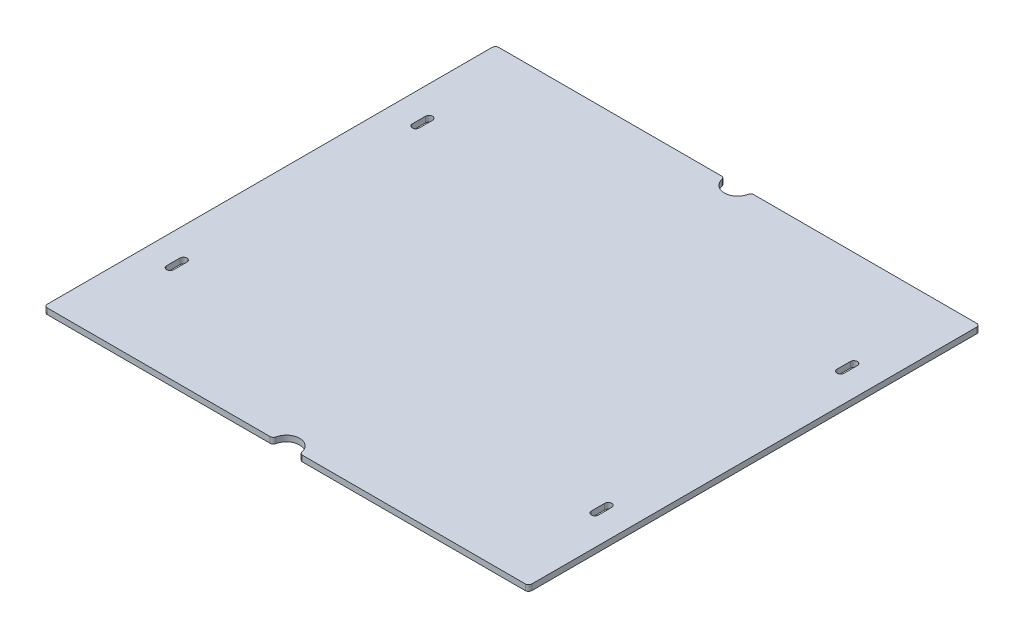
ISO-10303-21;
HEADER;
FILE_DESCRIPTION(('STEP AP214'),'2;1');
FILE_NAME('part.step','',(''),(''),'','','');
FILE_SCHEMA(('AUTOMOTIVE_DESIGN { 1 0 10303 214 1 1 1 1 }'));
ENDSEC;
DATA;
#1=APPLICATION_CONTEXT('core data for automotive mechanical design processes');
#2=APPLICATION_PROTOCOL_DEFINITION('international standard','automotive_design',2000,#1);
#3=PRODUCT_CONTEXT('',#1,'mechanical');
#4=PRODUCT('Part','Part','',(#3));
#5=PRODUCT_RELATED_PRODUCT_CATEGORY('part','',(#4));
#6=PRODUCT_DEFINITION_FORMATION('','',#4);
#7=PRODUCT_DEFINITION_CONTEXT('part definition',#1,'design');
#8=PRODUCT_DEFINITION('design','',#6,#7);
#9=PRODUCT_DEFINITION_SHAPE('','',#8);
#10=(LENGTH_UNIT() NAMED_UNIT(*) SI_UNIT(.MILLI.,.METRE.));
#11=(NAMED_UNIT(*) PLANE_ANGLE_UNIT() SI_UNIT($,.RADIAN.));
#12=(NAMED_UNIT(*) SI_UNIT($,.STERADIAN.) SOLID_ANGLE_UNIT());
#13=UNCERTAINTY_MEASURE_WITH_UNIT(LENGTH_MEASURE(1.E-05),#10,'distance_accuracy_value','');
#14=(GEOMETRIC_REPRESENTATION_CONTEXT(3) GLOBAL_UNCERTAINTY_ASSIGNED_CONTEXT((#13)) GLOBAL_UNIT_ASSIGNED_CONTEXT((#10,
#11,#12)) REPRESENTATION_CONTEXT('',''));
#15=CARTESIAN_POINT('',(0.,0.,0.));
#16=DIRECTION('',(0.,0.,1.));
#17=DIRECTION('',(1.,0.,0.));
#18=AXIS2_PLACEMENT_3D('',#15,#16,#17);
#19=CARTESIAN_POINT('',(0.,5.588,0.));
#20=DIRECTION('',(0.,0.,-1.));
#21=DIRECTION('',(-1.,0.,0.));
#22=AXIS2_PLACEMENT_3D('',#19,#20,#21);
#23=PLANE('',#22);
#24=DIRECTION('',(1.,0.,0.));
#25=VECTOR('',#24,1.);
#26=CARTESIAN_POINT('',(0.,0.,0.));
#27=LINE('',#26,#25);
#28=CARTESIAN_POINT('',(3.175,0.,0.));
#29=VERTEX_POINT('',#28);
#30=CARTESIAN_POINT('',(216.220740133327,0.,0.));
#31=VERTEX_POINT('',#30);
#32=EDGE_CURVE('E397',#29,#31,#27,.T.);
#33=ORIENTED_EDGE('',*,*,#32,.T.);
#34=DIRECTION('',(0.,1.,0.));
#35=VECTOR('',#34,1.);
#36=CARTESIAN_POINT('',(216.220740133327,5.588,0.));
#37=LINE('',#36,#35);
#38=CARTESIAN_POINT('',(216.220740133327,5.588,0.));
#39=VERTEX_POINT('',#38);
#40=EDGE_CURVE('E466',#31,#39,#37,.T.);
#41=ORIENTED_EDGE('',*,*,#40,.T.);
#42=DIRECTION('',(1.,0.,0.));
#43=VECTOR('',#42,1.);
#44=CARTESIAN_POINT('',(0.,5.588,0.));
#45=LINE('',#44,#43);
#46=CARTESIAN_POINT('',(3.175,5.588,0.));
#47=VERTEX_POINT('',#46);
#48=EDGE_CURVE('E384',#47,#39,#45,.T.);
#49=ORIENTED_EDGE('',*,*,#48,.F.);
#50=DIRECTION('',(0.,-1.,0.));
#51=VECTOR('',#50,1.);
#52=CARTESIAN_POINT('',(3.175,5.588,0.));
#53=LINE('',#52,#51);
#54=EDGE_CURVE('E442',#47,#29,#53,.T.);
#55=ORIENTED_EDGE('',*,*,#54,.T.);
#56=EDGE_LOOP('',(#33,#41,#49,#55));
#57=FACE_BOUND('',#56,.T.);
#58=ADVANCED_FACE('F32',(#57),#23,.F.);
#59=CARTESIAN_POINT('',(0.,5.588,-431.8));
#60=DIRECTION('',(0.,0.,1.));
#61=DIRECTION('',(1.,0.,0.));
#62=AXIS2_PLACEMENT_3D('',#59,#60,#61);
#63=PLANE('',#62);
#64=DIRECTION('',(-1.,0.,0.));
#65=VECTOR('',#64,1.);
#66=CARTESIAN_POINT('',(0.,0.,-431.8));
#67=LINE('',#66,#65);
#68=CARTESIAN_POINT('',(460.375,0.,-431.8));
#69=VERTEX_POINT('',#68);
#70=CARTESIAN_POINT('',(247.329259866673,0.,-431.8));
#71=VERTEX_POINT('',#70);
#72=EDGE_CURVE('E383',#69,#71,#67,.T.);
#73=ORIENTED_EDGE('',*,*,#72,.T.);
#74=DIRECTION('',(0.,1.,0.));
#75=VECTOR('',#74,1.);
#76=CARTESIAN_POINT('',(247.329259866673,5.588,-431.8));
#77=LINE('',#76,#75);
#78=CARTESIAN_POINT('',(247.329259866673,5.588,-431.8));
#79=VERTEX_POINT('',#78);
#80=EDGE_CURVE('E11',#71,#79,#77,.T.);
#81=ORIENTED_EDGE('',*,*,#80,.T.);
#82=DIRECTION('',(-1.,0.,0.));
#83=VECTOR('',#82,1.);
#84=CARTESIAN_POINT('',(0.,5.588,-431.8));
#85=LINE('',#84,#83);
#86=CARTESIAN_POINT('',(460.375,5.588,-431.8));
#87=VERTEX_POINT('',#86);
#88=EDGE_CURVE('E390',#87,#79,#85,.T.);
#89=ORIENTED_EDGE('',*,*,#88,.F.);
#90=DIRECTION('',(0.,-1.,0.));
#91=VECTOR('',#90,1.);
#92=CARTESIAN_POINT('',(460.375,5.588,-431.8));
#93=LINE('',#92,#91);
#94=EDGE_CURVE('E420',#87,#69,#93,.T.);
#95=ORIENTED_EDGE('',*,*,#94,.T.);
#96=EDGE_LOOP('',(#73,#81,#89,#95));
#97=FACE_BOUND('',#96,.T.);
#98=ADVANCED_FACE('F502',(#97),#63,.F.);
#99=CARTESIAN_POINT('',(0.,5.588,0.));
#100=DIRECTION('',(0.,-1.,0.));
#101=DIRECTION('',(0.,0.,-1.));
#102=AXIS2_PLACEMENT_3D('',#99,#100,#101);
#103=PLANE('',#102);
#104=CARTESIAN_POINT('',(434.975,5.588,-92.0749999999998));
#105=DIRECTION('',(0.,1.,0.));
#106=DIRECTION('',(0.,0.,1.));
#107=AXIS2_PLACEMENT_3D('',#104,#105,#106);
#108=CIRCLE('',#107,3.3782);
#109=CARTESIAN_POINT('',(431.5968,5.588,-92.0749999999998));
#110=VERTEX_POINT('',#109);
#111=CARTESIAN_POINT('',(438.3532,5.588,-92.0749999999998));
#112=VERTEX_POINT('',#111);
#113=EDGE_CURVE('E286',#110,#112,#108,.T.);
#114=ORIENTED_EDGE('',*,*,#113,.F.);
#115=DIRECTION('',(0.,0.,1.));
#116=VECTOR('',#115,1.);
#117=CARTESIAN_POINT('',(431.5968,5.588,-92.0749999999998));
#118=LINE('',#117,#116);
#119=CARTESIAN_POINT('',(431.5968,5.588,-104.775));
#120=VERTEX_POINT('',#119);
#121=EDGE_CURVE('E294',#120,#110,#118,.T.);
#122=ORIENTED_EDGE('',*,*,#121,.F.);
#123=CARTESIAN_POINT('',(434.975,5.588,-104.775));
#124=DIRECTION('',(0.,1.,0.));
#125=DIRECTION('',(0.,0.,1.));
#126=AXIS2_PLACEMENT_3D('',#123,#124,#125);
#127=CIRCLE('',#126,3.3782);
#128=CARTESIAN_POINT('',(438.3532,5.588,-104.775));
#129=VERTEX_POINT('',#128);
#130=EDGE_CURVE('E291',#129,#120,#127,.T.);
#131=ORIENTED_EDGE('',*,*,#130,.F.);
#132=DIRECTION('',(0.,0.,-1.));
#133=VECTOR('',#132,1.);
#134=CARTESIAN_POINT('',(438.3532,5.588,-92.0749999999998));
#135=LINE('',#134,#133);
#136=EDGE_CURVE('E288',#112,#129,#135,.T.);
#137=ORIENTED_EDGE('',*,*,#136,.F.);
#138=EDGE_LOOP('',(#114,#122,#131,#137));
#139=FACE_BOUND('',#138,.T.);
#140=CARTESIAN_POINT('',(28.575,5.588,-339.725));
#141=DIRECTION('',(0.,1.,0.));
#142=DIRECTION('',(0.,0.,1.));
#143=AXIS2_PLACEMENT_3D('',#140,#141,#142);
#144=CIRCLE('',#143,3.37819999999998);
#145=CARTESIAN_POINT('',(31.9532,5.588,-339.725));
#146=VERTEX_POINT('',#145);
#147=CARTESIAN_POINT('',(25.1968,5.588,-339.725));
#148=VERTEX_POINT('',#147);
#149=EDGE_CURVE('E348',#146,#148,#144,.T.);
#150=ORIENTED_EDGE('',*,*,#149,.F.);
#151=DIRECTION('',(0.,0.,-1.));
#152=VECTOR('',#151,1.);
#153=CARTESIAN_POINT('',(31.9532,5.588,-339.725));
#154=LINE('',#153,#152);
#155=CARTESIAN_POINT('',(31.9532,5.588,-327.025));
#156=VERTEX_POINT('',#155);
#157=EDGE_CURVE('E356',#156,#146,#154,.T.);
#158=ORIENTED_EDGE('',*,*,#157,.F.);
#159=CARTESIAN_POINT('',(28.575,5.588,-327.025));
#160=DIRECTION('',(0.,1.,0.));
#161=DIRECTION('',(0.,0.,1.));
#162=AXIS2_PLACEMENT_3D('',#159,#160,#161);
#163=CIRCLE('',#162,3.37819999999998);
#164=CARTESIAN_POINT('',(25.1968,5.588,-327.025));
#165=VERTEX_POINT('',#164);
#166=EDGE_CURVE('E353',#165,#156,#163,.T.);
#167=ORIENTED_EDGE('',*,*,#166,.F.);
#168=DIRECTION('',(0.,0.,1.));
#169=VECTOR('',#168,1.);
#170=CARTESIAN_POINT('',(25.1968,5.588,-339.725));
#171=LINE('',#170,#169);
#172=EDGE_CURVE('E350',#148,#165,#171,.T.);
#173=ORIENTED_EDGE('',*,*,#172,.F.);
#174=EDGE_LOOP('',(#150,#158,#167,#173));
#175=FACE_BOUND('',#174,.T.);
#176=CARTESIAN_POINT('',(231.775,5.588,-431.8));
#177=DIRECTION('',(0.,1.,0.));
#178=DIRECTION('',(0.,0.,1.));
#179=AXIS2_PLACEMENT_3D('',#176,#177,#178);
#180=CIRCLE('',#179,12.7);
#181=CARTESIAN_POINT('',(219.331592106661,5.588,-429.26));
#182=VERTEX_POINT('',#181);
#183=CARTESIAN_POINT('',(244.218407893339,5.588,-429.26));
#184=VERTEX_POINT('',#183);
#185=EDGE_CURVE('E509',#182,#184,#180,.T.);
#186=ORIENTED_EDGE('',*,*,#185,.F.);
#187=CARTESIAN_POINT('',(216.220740133327,5.588,-428.625));
#188=DIRECTION('',(0.,-1.,0.));
#189=DIRECTION('',(0.,0.,-1.));
#190=AXIS2_PLACEMENT_3D('',#187,#188,#189);
#191=CIRCLE('',#190,3.175);
#192=CARTESIAN_POINT('',(216.220740133327,5.588,-431.8));
#193=VERTEX_POINT('',#192);
#194=EDGE_CURVE('E464',#182,#193,#191,.F.);
#195=ORIENTED_EDGE('',*,*,#194,.T.);
#196=CARTESIAN_POINT('',(3.175,5.588,-431.8));
#197=VERTEX_POINT('',#196);
#198=EDGE_CURVE('E389',#193,#197,#85,.T.);
#199=ORIENTED_EDGE('',*,*,#198,.T.);
#200=CARTESIAN_POINT('',(3.175,5.588,-428.625));
#201=DIRECTION('',(0.,-1.,0.));
#202=DIRECTION('',(0.,0.,-1.));
#203=AXIS2_PLACEMENT_3D('',#200,#201,#202);
#204=CIRCLE('',#203,3.175);
#205=CARTESIAN_POINT('',(0.,5.588,-428.625));
#206=VERTEX_POINT('',#205);
#207=EDGE_CURVE('E432',#197,#206,#204,.F.);
#208=ORIENTED_EDGE('',*,*,#207,.T.);
#209=DIRECTION('',(0.,0.,1.));
#210=VECTOR('',#209,1.);
#211=CARTESIAN_POINT('',(0.,5.588,0.));
#212=LINE('',#211,#210);
#213=CARTESIAN_POINT('',(0.,5.588,-3.175));
#214=VERTEX_POINT('',#213);
#215=EDGE_CURVE('E379',#206,#214,#212,.T.);
#216=ORIENTED_EDGE('',*,*,#215,.T.);
#217=CARTESIAN_POINT('',(3.175,5.588,-3.175));
#218=DIRECTION('',(0.,-1.,0.));
#219=DIRECTION('',(0.,0.,-1.));
#220=AXIS2_PLACEMENT_3D('',#217,#218,#219);
#221=CIRCLE('',#220,3.175);
#222=EDGE_CURVE('E428',#214,#47,#221,.F.);
#223=ORIENTED_EDGE('',*,*,#222,.T.);
#224=ORIENTED_EDGE('',*,*,#48,.T.);
#225=CARTESIAN_POINT('',(216.220740133327,5.588,-3.175));
#226=DIRECTION('',(0.,-1.,0.));
#227=DIRECTION('',(0.,0.,-1.));
#228=AXIS2_PLACEMENT_3D('',#225,#226,#227);
#229=CIRCLE('',#228,3.175);
#230=CARTESIAN_POINT('',(219.331592106661,5.588,-2.54));
#231=VERTEX_POINT('',#230);
#232=EDGE_CURVE('E53',#39,#231,#229,.F.);
#233=ORIENTED_EDGE('',*,*,#232,.T.);
#234=CARTESIAN_POINT('',(231.775,5.588,0.));
#235=DIRECTION('',(0.,1.,0.));
#236=DIRECTION('',(0.,0.,1.));
#237=AXIS2_PLACEMENT_3D('',#234,#235,#236);
#238=CIRCLE('',#237,12.7);
#239=CARTESIAN_POINT('',(244.218407893339,5.588,-2.54));
#240=VERTEX_POINT('',#239);
#241=EDGE_CURVE('E519',#240,#231,#238,.T.);
#242=ORIENTED_EDGE('',*,*,#241,.F.);
#243=CARTESIAN_POINT('',(247.329259866673,5.588,-3.175));
#244=DIRECTION('',(0.,-1.,0.));
#245=DIRECTION('',(0.,0.,-1.));
#246=AXIS2_PLACEMENT_3D('',#243,#244,#245);
#247=CIRCLE('',#246,3.175);
#248=CARTESIAN_POINT('',(247.329259866673,5.588,0.));
#249=VERTEX_POINT('',#248);
#250=EDGE_CURVE('E47',#240,#249,#247,.F.);
#251=ORIENTED_EDGE('',*,*,#250,.T.);
#252=CARTESIAN_POINT('',(460.375,5.588,0.));
#253=VERTEX_POINT('',#252);
#254=EDGE_CURVE('E382',#249,#253,#45,.T.);
#255=ORIENTED_EDGE('',*,*,#254,.T.);
#256=CARTESIAN_POINT('',(460.375,5.588,-3.175));
#257=DIRECTION('',(0.,-1.,0.));
#258=DIRECTION('',(0.,0.,-1.));
#259=AXIS2_PLACEMENT_3D('',#256,#257,#258);
#260=CIRCLE('',#259,3.175);
#261=CARTESIAN_POINT('',(463.55,5.588,-3.175));
#262=VERTEX_POINT('',#261);
#263=EDGE_CURVE('E426',#253,#262,#260,.F.);
#264=ORIENTED_EDGE('',*,*,#263,.T.);
#265=DIRECTION('',(0.,0.,-1.));
#266=VECTOR('',#265,1.);
#267=CARTESIAN_POINT('',(463.55,5.588,0.));
#268=LINE('',#267,#266);
#269=CARTESIAN_POINT('',(463.55,5.588,-428.625));
#270=VERTEX_POINT('',#269);
#271=EDGE_CURVE('E386',#262,#270,#268,.T.);
#272=ORIENTED_EDGE('',*,*,#271,.T.);
#273=CARTESIAN_POINT('',(460.375,5.588,-428.625));
#274=DIRECTION('',(0.,-1.,0.));
#275=DIRECTION('',(0.,0.,-1.));
#276=AXIS2_PLACEMENT_3D('',#273,#274,#275);
#277=CIRCLE('',#276,3.175);
#278=EDGE_CURVE('E430',#270,#87,#277,.F.);
#279=ORIENTED_EDGE('',*,*,#278,.T.);
#280=ORIENTED_EDGE('',*,*,#88,.T.);
#281=CARTESIAN_POINT('',(247.329259866673,5.588,-428.625));
#282=DIRECTION('',(0.,-1.,0.));
#283=DIRECTION('',(0.,0.,-1.));
#284=AXIS2_PLACEMENT_3D('',#281,#282,#283);
#285=CIRCLE('',#284,3.175);
#286=EDGE_CURVE('E460',#79,#184,#285,.F.);
#287=ORIENTED_EDGE('',*,*,#286,.T.);
#288=EDGE_LOOP('',(#186,#195,#199,#208,#216,#223,#224,#233,#242,#251,#255,#264,#272,#279,#280,#287));
#289=FACE_BOUND('',#288,.T.);
#290=CARTESIAN_POINT('',(28.575,5.588,-92.075));
#291=DIRECTION('',(0.,1.,0.));
#292=DIRECTION('',(0.,0.,-1.));
#293=AXIS2_PLACEMENT_3D('',#290,#291,#292);
#294=CIRCLE('',#293,3.37819999999998);
#295=CARTESIAN_POINT('',(25.1968,5.588,-92.0749999999998));
#296=VERTEX_POINT('',#295);
#297=CARTESIAN_POINT('',(31.9532,5.588,-92.075));
#298=VERTEX_POINT('',#297);
#299=EDGE_CURVE('E317',#296,#298,#294,.T.);
#300=ORIENTED_EDGE('',*,*,#299,.F.);
#301=DIRECTION('',(0.,0.,1.));
#302=VECTOR('',#301,1.);
#303=CARTESIAN_POINT('',(25.1968,5.588,-92.0749999999998));
#304=LINE('',#303,#302);
#305=CARTESIAN_POINT('',(25.1968,5.588,-104.775));
#306=VERTEX_POINT('',#305);
#307=EDGE_CURVE('E325',#306,#296,#304,.T.);
#308=ORIENTED_EDGE('',*,*,#307,.F.);
#309=CARTESIAN_POINT('',(28.575,5.588,-104.775));
#310=DIRECTION('',(0.,1.,0.));
#311=DIRECTION('',(0.,0.,-1.));
#312=AXIS2_PLACEMENT_3D('',#309,#310,#311);
#313=CIRCLE('',#312,3.37819999999998);
#314=CARTESIAN_POINT('',(31.9532,5.588,-104.775));
#315=VERTEX_POINT('',#314);
#316=EDGE_CURVE('E322',#315,#306,#313,.T.);
#317=ORIENTED_EDGE('',*,*,#316,.F.);
#318=DIRECTION('',(0.,0.,-1.));
#319=VECTOR('',#318,1.);
#320=CARTESIAN_POINT('',(31.9532,5.588,-92.075));
#321=LINE('',#320,#319);
#322=EDGE_CURVE('E319',#298,#315,#321,.T.);
#323=ORIENTED_EDGE('',*,*,#322,.F.);
#324=EDGE_LOOP('',(#300,#308,#317,#323));
#325=FACE_BOUND('',#324,.T.);
#326=CARTESIAN_POINT('',(434.975,5.588,-339.725));
#327=DIRECTION('',(0.,1.,0.));
#328=DIRECTION('',(0.,0.,-1.));
#329=AXIS2_PLACEMENT_3D('',#326,#327,#328);
#330=CIRCLE('',#329,3.3782);
#331=CARTESIAN_POINT('',(438.3532,5.588,-339.725));
#332=VERTEX_POINT('',#331);
#333=CARTESIAN_POINT('',(431.5968,5.588,-339.725));
#334=VERTEX_POINT('',#333);
#335=EDGE_CURVE('E242',#332,#334,#330,.T.);
#336=ORIENTED_EDGE('',*,*,#335,.F.);
#337=DIRECTION('',(0.,0.,-1.));
#338=VECTOR('',#337,1.);
#339=CARTESIAN_POINT('',(438.3532,5.588,-339.725));
#340=LINE('',#339,#338);
#341=CARTESIAN_POINT('',(438.3532,5.588,-327.025));
#342=VERTEX_POINT('',#341);
#343=EDGE_CURVE('E268',#342,#332,#340,.T.);
#344=ORIENTED_EDGE('',*,*,#343,.F.);
#345=CARTESIAN_POINT('',(434.975,5.588,-327.025));
#346=DIRECTION('',(0.,1.,0.));
#347=DIRECTION('',(0.,0.,-1.));
#348=AXIS2_PLACEMENT_3D('',#345,#346,#347);
#349=CIRCLE('',#348,3.3782);
#350=CARTESIAN_POINT('',(431.5968,5.588,-327.025));
#351=VERTEX_POINT('',#350);
#352=EDGE_CURVE('E266',#351,#342,#349,.T.);
#353=ORIENTED_EDGE('',*,*,#352,.F.);
#354=DIRECTION('',(0.,0.,1.));
#355=VECTOR('',#354,1.);
#356=CARTESIAN_POINT('',(431.5968,5.588,-339.725));
#357=LINE('',#356,#355);
#358=EDGE_CURVE('E252',#334,#351,#357,.T.);
#359=ORIENTED_EDGE('',*,*,#358,.F.);
#360=EDGE_LOOP('',(#336,#344,#353,#359));
#361=FACE_BOUND('',#360,.T.);
#362=ADVANCED_FACE('F264',(#139,#175,#289,#325,#361),#103,.F.);
#363=CARTESIAN_POINT('',(0.,0.,0.));
#364=DIRECTION('',(0.,-1.,0.));
#365=DIRECTION('',(0.,0.,-1.));
#366=AXIS2_PLACEMENT_3D('',#363,#364,#365);
#367=PLANE('',#366);
#368=CARTESIAN_POINT('',(216.220740133327,0.,-431.8));
#369=VERTEX_POINT('',#368);
#370=CARTESIAN_POINT('',(3.175,0.,-431.8));
#371=VERTEX_POINT('',#370);
#372=EDGE_CURVE('E403',#369,#371,#67,.T.);
#373=ORIENTED_EDGE('',*,*,#372,.F.);
#374=CARTESIAN_POINT('',(216.220740133327,0.,-428.625));
#375=DIRECTION('',(0.,-1.,0.));
#376=DIRECTION('',(0.,0.,-1.));
#377=AXIS2_PLACEMENT_3D('',#374,#375,#376);
#378=CIRCLE('',#377,3.175);
#379=CARTESIAN_POINT('',(219.331592106661,0.,-429.26));
#380=VERTEX_POINT('',#379);
#381=EDGE_CURVE('E454',#369,#380,#378,.T.);
#382=ORIENTED_EDGE('',*,*,#381,.T.);
#383=CARTESIAN_POINT('',(231.775,0.,-431.8));
#384=DIRECTION('',(0.,1.,0.));
#385=DIRECTION('',(0.,0.,1.));
#386=AXIS2_PLACEMENT_3D('',#383,#384,#385);
#387=CIRCLE('',#386,12.7);
#388=CARTESIAN_POINT('',(244.218407893339,0.,-429.26));
#389=VERTEX_POINT('',#388);
#390=EDGE_CURVE('E275',#380,#389,#387,.T.);
#391=ORIENTED_EDGE('',*,*,#390,.T.);
#392=CARTESIAN_POINT('',(247.329259866673,0.,-428.625));
#393=DIRECTION('',(0.,-1.,0.));
#394=DIRECTION('',(0.,0.,-1.));
#395=AXIS2_PLACEMENT_3D('',#392,#393,#394);
#396=CIRCLE('',#395,3.175);
#397=EDGE_CURVE('E448',#389,#71,#396,.T.);
#398=ORIENTED_EDGE('',*,*,#397,.T.);
#399=ORIENTED_EDGE('',*,*,#72,.F.);
#400=CARTESIAN_POINT('',(460.375,0.,-428.625));
#401=DIRECTION('',(0.,-1.,0.));
#402=DIRECTION('',(0.,0.,-1.));
#403=AXIS2_PLACEMENT_3D('',#400,#401,#402);
#404=CIRCLE('',#403,3.175);
#405=CARTESIAN_POINT('',(463.55,0.,-428.625));
#406=VERTEX_POINT('',#405);
#407=EDGE_CURVE('E415',#69,#406,#404,.T.);
#408=ORIENTED_EDGE('',*,*,#407,.T.);
#409=DIRECTION('',(0.,0.,-1.));
#410=VECTOR('',#409,1.);
#411=CARTESIAN_POINT('',(463.55,0.,0.));
#412=LINE('',#411,#410);
#413=CARTESIAN_POINT('',(463.55,0.,-3.175));
#414=VERTEX_POINT('',#413);
#415=EDGE_CURVE('E400',#414,#406,#412,.T.);
#416=ORIENTED_EDGE('',*,*,#415,.F.);
#417=CARTESIAN_POINT('',(460.375,0.,-3.175));
#418=DIRECTION('',(0.,-1.,0.));
#419=DIRECTION('',(0.,0.,-1.));
#420=AXIS2_PLACEMENT_3D('',#417,#418,#419);
#421=CIRCLE('',#420,3.175);
#422=CARTESIAN_POINT('',(460.375,0.,0.));
#423=VERTEX_POINT('',#422);
#424=EDGE_CURVE('E410',#414,#423,#421,.T.);
#425=ORIENTED_EDGE('',*,*,#424,.T.);
#426=CARTESIAN_POINT('',(247.329259866673,0.,0.));
#427=VERTEX_POINT('',#426);
#428=EDGE_CURVE('E396',#427,#423,#27,.T.);
#429=ORIENTED_EDGE('',*,*,#428,.F.);
#430=CARTESIAN_POINT('',(247.329259866673,0.,-3.175));
#431=DIRECTION('',(0.,-1.,0.));
#432=DIRECTION('',(0.,0.,-1.));
#433=AXIS2_PLACEMENT_3D('',#430,#431,#432);
#434=CIRCLE('',#433,3.175);
#435=CARTESIAN_POINT('',(244.218407893339,0.,-2.54));
#436=VERTEX_POINT('',#435);
#437=EDGE_CURVE('E450',#427,#436,#434,.T.);
#438=ORIENTED_EDGE('',*,*,#437,.T.);
#439=CARTESIAN_POINT('',(231.775,0.,0.));
#440=DIRECTION('',(0.,1.,0.));
#441=DIRECTION('',(0.,0.,1.));
#442=AXIS2_PLACEMENT_3D('',#439,#440,#441);
#443=CIRCLE('',#442,12.7);
#444=CARTESIAN_POINT('',(219.331592106661,0.,-2.54));
#445=VERTEX_POINT('',#444);
#446=EDGE_CURVE('E516',#436,#445,#443,.T.);
#447=ORIENTED_EDGE('',*,*,#446,.T.);
#448=CARTESIAN_POINT('',(216.220740133327,0.,-3.175));
#449=DIRECTION('',(0.,-1.,0.));
#450=DIRECTION('',(0.,0.,-1.));
#451=AXIS2_PLACEMENT_3D('',#448,#449,#450);
#452=CIRCLE('',#451,3.175);
#453=EDGE_CURVE('E452',#445,#31,#452,.T.);
#454=ORIENTED_EDGE('',*,*,#453,.T.);
#455=ORIENTED_EDGE('',*,*,#32,.F.);
#456=CARTESIAN_POINT('',(3.175,0.,-3.175));
#457=DIRECTION('',(0.,-1.,0.));
#458=DIRECTION('',(0.,0.,-1.));
#459=AXIS2_PLACEMENT_3D('',#456,#457,#458);
#460=CIRCLE('',#459,3.175);
#461=CARTESIAN_POINT('',(0.,0.,-3.175));
#462=VERTEX_POINT('',#461);
#463=EDGE_CURVE('E413',#29,#462,#460,.T.);
#464=ORIENTED_EDGE('',*,*,#463,.T.);
#465=DIRECTION('',(0.,0.,1.));
#466=VECTOR('',#465,1.);
#467=CARTESIAN_POINT('',(0.,0.,0.));
#468=LINE('',#467,#466);
#469=CARTESIAN_POINT('',(0.,0.,-428.625));
#470=VERTEX_POINT('',#469);
#471=EDGE_CURVE('E378',#470,#462,#468,.T.);
#472=ORIENTED_EDGE('',*,*,#471,.F.);
#473=CARTESIAN_POINT('',(3.175,0.,-428.625));
#474=DIRECTION('',(0.,-1.,0.));
#475=DIRECTION('',(0.,0.,-1.));
#476=AXIS2_PLACEMENT_3D('',#473,#474,#475);
#477=CIRCLE('',#476,3.175);
#478=EDGE_CURVE('E417',#470,#371,#477,.T.);
#479=ORIENTED_EDGE('',*,*,#478,.T.);
#480=EDGE_LOOP('',(#373,#382,#391,#398,#399,#408,#416,#425,#429,#438,#447,#454,#455,#464,#472,#479));
#481=FACE_BOUND('',#480,.T.);
#482=DIRECTION('',(0.,0.,-1.));
#483=VECTOR('',#482,1.);
#484=CARTESIAN_POINT('',(31.9532,0.,-339.725));
#485=LINE('',#484,#483);
#486=CARTESIAN_POINT('',(31.9532,0.,-327.025));
#487=VERTEX_POINT('',#486);
#488=CARTESIAN_POINT('',(31.9532,0.,-339.725));
#489=VERTEX_POINT('',#488);
#490=EDGE_CURVE('E351',#487,#489,#485,.T.);
#491=ORIENTED_EDGE('',*,*,#490,.T.);
#492=CARTESIAN_POINT('',(28.575,0.,-339.725));
#493=DIRECTION('',(0.,1.,0.));
#494=DIRECTION('',(0.,0.,1.));
#495=AXIS2_PLACEMENT_3D('',#492,#493,#494);
#496=CIRCLE('',#495,3.37819999999998);
#497=CARTESIAN_POINT('',(25.1968,0.,-339.725));
#498=VERTEX_POINT('',#497);
#499=EDGE_CURVE('E347',#489,#498,#496,.T.);
#500=ORIENTED_EDGE('',*,*,#499,.T.);
#501=DIRECTION('',(0.,0.,1.));
#502=VECTOR('',#501,1.);
#503=CARTESIAN_POINT('',(25.1968,0.,-339.725));
#504=LINE('',#503,#502);
#505=CARTESIAN_POINT('',(25.1968,0.,-327.025));
#506=VERTEX_POINT('',#505);
#507=EDGE_CURVE('E361',#498,#506,#504,.T.);
#508=ORIENTED_EDGE('',*,*,#507,.T.);
#509=CARTESIAN_POINT('',(28.575,0.,-327.025));
#510=DIRECTION('',(0.,1.,0.));
#511=DIRECTION('',(0.,0.,1.));
#512=AXIS2_PLACEMENT_3D('',#509,#510,#511);
#513=CIRCLE('',#512,3.37819999999998);
#514=EDGE_CURVE('E364',#506,#487,#513,.T.);
#515=ORIENTED_EDGE('',*,*,#514,.T.);
#516=EDGE_LOOP('',(#491,#500,#508,#515));
#517=FACE_BOUND('',#516,.T.);
#518=DIRECTION('',(0.,0.,1.));
#519=VECTOR('',#518,1.);
#520=CARTESIAN_POINT('',(25.1968,0.,-92.0749999999998));
#521=LINE('',#520,#519);
#522=CARTESIAN_POINT('',(25.1968,0.,-104.775));
#523=VERTEX_POINT('',#522);
#524=CARTESIAN_POINT('',(25.1968,0.,-92.0749999999998));
#525=VERTEX_POINT('',#524);
#526=EDGE_CURVE('E320',#523,#525,#521,.T.);
#527=ORIENTED_EDGE('',*,*,#526,.T.);
#528=CARTESIAN_POINT('',(28.575,0.,-92.075));
#529=DIRECTION('',(0.,1.,0.));
#530=DIRECTION('',(0.,0.,-1.));
#531=AXIS2_PLACEMENT_3D('',#528,#529,#530);
#532=CIRCLE('',#531,3.37819999999998);
#533=CARTESIAN_POINT('',(31.9532,0.,-92.075));
#534=VERTEX_POINT('',#533);
#535=EDGE_CURVE('E316',#525,#534,#532,.T.);
#536=ORIENTED_EDGE('',*,*,#535,.T.);
#537=DIRECTION('',(0.,0.,-1.));
#538=VECTOR('',#537,1.);
#539=CARTESIAN_POINT('',(31.9532,0.,-92.075));
#540=LINE('',#539,#538);
#541=CARTESIAN_POINT('',(31.9532,0.,-104.775));
#542=VERTEX_POINT('',#541);
#543=EDGE_CURVE('E330',#534,#542,#540,.T.);
#544=ORIENTED_EDGE('',*,*,#543,.T.);
#545=CARTESIAN_POINT('',(28.575,0.,-104.775));
#546=DIRECTION('',(0.,1.,0.));
#547=DIRECTION('',(0.,0.,-1.));
#548=AXIS2_PLACEMENT_3D('',#545,#546,#547);
#549=CIRCLE('',#548,3.37819999999998);
#550=EDGE_CURVE('E333',#542,#523,#549,.T.);
#551=ORIENTED_EDGE('',*,*,#550,.T.);
#552=EDGE_LOOP('',(#527,#536,#544,#551));
#553=FACE_BOUND('',#552,.T.);
#554=DIRECTION('',(0.,0.,1.));
#555=VECTOR('',#554,1.);
#556=CARTESIAN_POINT('',(431.5968,0.,-92.0749999999998));
#557=LINE('',#556,#555);
#558=CARTESIAN_POINT('',(431.5968,0.,-104.775));
#559=VERTEX_POINT('',#558);
#560=CARTESIAN_POINT('',(431.5968,0.,-92.0749999999998));
#561=VERTEX_POINT('',#560);
#562=EDGE_CURVE('E289',#559,#561,#557,.T.);
#563=ORIENTED_EDGE('',*,*,#562,.T.);
#564=CARTESIAN_POINT('',(434.975,0.,-92.0749999999998));
#565=DIRECTION('',(0.,1.,0.));
#566=DIRECTION('',(0.,0.,1.));
#567=AXIS2_PLACEMENT_3D('',#564,#565,#566);
#568=CIRCLE('',#567,3.3782);
#569=CARTESIAN_POINT('',(438.3532,0.,-92.0749999999998));
#570=VERTEX_POINT('',#569);
#571=EDGE_CURVE('E260',#561,#570,#568,.T.);
#572=ORIENTED_EDGE('',*,*,#571,.T.);
#573=DIRECTION('',(0.,0.,-1.));
#574=VECTOR('',#573,1.);
#575=CARTESIAN_POINT('',(438.3532,0.,-92.0749999999998));
#576=LINE('',#575,#574);
#577=CARTESIAN_POINT('',(438.3532,0.,-104.775));
#578=VERTEX_POINT('',#577);
#579=EDGE_CURVE('E299',#570,#578,#576,.T.);
#580=ORIENTED_EDGE('',*,*,#579,.T.);
#581=CARTESIAN_POINT('',(434.975,0.,-104.775));
#582=DIRECTION('',(0.,1.,0.));
#583=DIRECTION('',(0.,0.,1.));
#584=AXIS2_PLACEMENT_3D('',#581,#582,#583);
#585=CIRCLE('',#584,3.3782);
#586=EDGE_CURVE('E302',#578,#559,#585,.T.);
#587=ORIENTED_EDGE('',*,*,#586,.T.);
#588=EDGE_LOOP('',(#563,#572,#580,#587));
#589=FACE_BOUND('',#588,.T.);
#590=DIRECTION('',(0.,0.,-1.));
#591=VECTOR('',#590,1.);
#592=CARTESIAN_POINT('',(438.3532,0.,-339.725));
#593=LINE('',#592,#591);
#594=CARTESIAN_POINT('',(438.3532,0.,-327.025));
#595=VERTEX_POINT('',#594);
#596=CARTESIAN_POINT('',(438.3532,0.,-339.725));
#597=VERTEX_POINT('',#596);
#598=EDGE_CURVE('E253',#595,#597,#593,.T.);
#599=ORIENTED_EDGE('',*,*,#598,.T.);
#600=CARTESIAN_POINT('',(434.975,0.,-339.725));
#601=DIRECTION('',(0.,1.,0.));
#602=DIRECTION('',(0.,0.,-1.));
#603=AXIS2_PLACEMENT_3D('',#600,#601,#602);
#604=CIRCLE('',#603,3.3782);
#605=CARTESIAN_POINT('',(431.5968,0.,-339.725));
#606=VERTEX_POINT('',#605);
#607=EDGE_CURVE('E273',#597,#606,#604,.T.);
#608=ORIENTED_EDGE('',*,*,#607,.T.);
#609=DIRECTION('',(0.,0.,1.));
#610=VECTOR('',#609,1.);
#611=CARTESIAN_POINT('',(431.5968,0.,-339.725));
#612=LINE('',#611,#610);
#613=CARTESIAN_POINT('',(431.5968,0.,-327.025));
#614=VERTEX_POINT('',#613);
#615=EDGE_CURVE('E259',#606,#614,#612,.T.);
#616=ORIENTED_EDGE('',*,*,#615,.T.);
#617=CARTESIAN_POINT('',(434.975,0.,-327.025));
#618=DIRECTION('',(0.,1.,0.));
#619=DIRECTION('',(0.,0.,-1.));
#620=AXIS2_PLACEMENT_3D('',#617,#618,#619);
#621=CIRCLE('',#620,3.3782);
#622=EDGE_CURVE('E277',#614,#595,#621,.T.);
#623=ORIENTED_EDGE('',*,*,#622,.T.);
#624=EDGE_LOOP('',(#599,#608,#616,#623));
#625=FACE_BOUND('',#624,.T.);
#626=ADVANCED_FACE('F480',(#481,#517,#553,#589,#625),#367,.T.);
#627=CARTESIAN_POINT('',(0.,5.588,0.));
#628=DIRECTION('',(1.,0.,0.));
#629=DIRECTION('',(0.,0.,-1.));
#630=AXIS2_PLACEMENT_3D('',#627,#628,#629);
#631=PLANE('',#630);
#632=ORIENTED_EDGE('',*,*,#215,.F.);
#633=DIRECTION('',(0.,-1.,0.));
#634=VECTOR('',#633,1.);
#635=CARTESIAN_POINT('',(0.,5.588,-428.625));
#636=LINE('',#635,#634);
#637=EDGE_CURVE('E407',#206,#470,#636,.T.);
#638=ORIENTED_EDGE('',*,*,#637,.T.);
#639=ORIENTED_EDGE('',*,*,#471,.T.);
#640=DIRECTION('',(0.,-1.,0.));
#641=VECTOR('',#640,1.);
#642=CARTESIAN_POINT('',(0.,5.588,-3.175));
#643=LINE('',#642,#641);
#644=EDGE_CURVE('E393',#462,#214,#643,.F.);
#645=ORIENTED_EDGE('',*,*,#644,.T.);
#646=EDGE_LOOP('',(#632,#638,#639,#645));
#647=FACE_BOUND('',#646,.T.);
#648=ADVANCED_FACE('F540',(#647),#631,.F.);
#649=ORIENTED_EDGE('',*,*,#254,.F.);
#650=DIRECTION('',(0.,1.,0.));
#651=VECTOR('',#650,1.);
#652=CARTESIAN_POINT('',(247.329259866673,5.588,0.));
#653=LINE('',#652,#651);
#654=EDGE_CURVE('E40',#249,#427,#653,.F.);
#655=ORIENTED_EDGE('',*,*,#654,.T.);
#656=ORIENTED_EDGE('',*,*,#428,.T.);
#657=DIRECTION('',(0.,-1.,0.));
#658=VECTOR('',#657,1.);
#659=CARTESIAN_POINT('',(460.375,5.588,0.));
#660=LINE('',#659,#658);
#661=EDGE_CURVE('E439',#423,#253,#660,.F.);
#662=ORIENTED_EDGE('',*,*,#661,.T.);
#663=EDGE_LOOP('',(#649,#655,#656,#662));
#664=FACE_BOUND('',#663,.T.);
#665=ADVANCED_FACE('F476',(#664),#23,.F.);
#666=CARTESIAN_POINT('',(463.55,5.588,0.));
#667=DIRECTION('',(-1.,0.,0.));
#668=DIRECTION('',(0.,0.,1.));
#669=AXIS2_PLACEMENT_3D('',#666,#667,#668);
#670=PLANE('',#669);
#671=ORIENTED_EDGE('',*,*,#415,.T.);
#672=DIRECTION('',(0.,-1.,0.));
#673=VECTOR('',#672,1.);
#674=CARTESIAN_POINT('',(463.55,5.588,-428.625));
#675=LINE('',#674,#673);
#676=EDGE_CURVE('E437',#406,#270,#675,.F.);
#677=ORIENTED_EDGE('',*,*,#676,.T.);
#678=ORIENTED_EDGE('',*,*,#271,.F.);
#679=DIRECTION('',(0.,-1.,0.));
#680=VECTOR('',#679,1.);
#681=CARTESIAN_POINT('',(463.55,5.588,-3.175));
#682=LINE('',#681,#680);
#683=EDGE_CURVE('E434',#262,#414,#682,.T.);
#684=ORIENTED_EDGE('',*,*,#683,.T.);
#685=EDGE_LOOP('',(#671,#677,#678,#684));
#686=FACE_BOUND('',#685,.T.);
#687=ADVANCED_FACE('F495',(#686),#670,.F.);
#688=ORIENTED_EDGE('',*,*,#198,.F.);
#689=DIRECTION('',(0.,1.,0.));
#690=VECTOR('',#689,1.);
#691=CARTESIAN_POINT('',(216.220740133327,5.588,-431.8));
#692=LINE('',#691,#690);
#693=EDGE_CURVE('E445',#193,#369,#692,.F.);
#694=ORIENTED_EDGE('',*,*,#693,.T.);
#695=ORIENTED_EDGE('',*,*,#372,.T.);
#696=DIRECTION('',(0.,-1.,0.));
#697=VECTOR('',#696,1.);
#698=CARTESIAN_POINT('',(3.175,5.588,-431.8));
#699=LINE('',#698,#697);
#700=EDGE_CURVE('E423',#371,#197,#699,.F.);
#701=ORIENTED_EDGE('',*,*,#700,.T.);
#702=EDGE_LOOP('',(#688,#694,#695,#701));
#703=FACE_BOUND('',#702,.T.);
#704=ADVANCED_FACE('F548',(#703),#63,.F.);
#705=CARTESIAN_POINT('',(28.575,5.588,-339.725));
#706=DIRECTION('',(0.,-1.,0.));
#707=DIRECTION('',(0.,0.,-1.));
#708=AXIS2_PLACEMENT_3D('',#705,#706,#707);
#709=CYLINDRICAL_SURFACE('',#708,3.37819999999998);
#710=ORIENTED_EDGE('',*,*,#499,.F.);
#711=DIRECTION('',(0.,-1.,0.));
#712=VECTOR('',#711,1.);
#713=CARTESIAN_POINT('',(31.9532,5.588,-339.725));
#714=LINE('',#713,#712);
#715=EDGE_CURVE('E358',#146,#489,#714,.T.);
#716=ORIENTED_EDGE('',*,*,#715,.F.);
#717=ORIENTED_EDGE('',*,*,#149,.T.);
#718=DIRECTION('',(0.,-1.,0.));
#719=VECTOR('',#718,1.);
#720=CARTESIAN_POINT('',(25.1968,5.588,-339.725));
#721=LINE('',#720,#719);
#722=EDGE_CURVE('E375',#148,#498,#721,.T.);
#723=ORIENTED_EDGE('',*,*,#722,.T.);
#724=EDGE_LOOP('',(#710,#716,#717,#723));
#725=FACE_BOUND('',#724,.T.);
#726=ADVANCED_FACE('F648',(#725),#709,.F.);
#727=CARTESIAN_POINT('',(25.1968,5.588,-339.725));
#728=DIRECTION('',(1.,0.,0.));
#729=DIRECTION('',(0.,0.,-1.));
#730=AXIS2_PLACEMENT_3D('',#727,#728,#729);
#731=PLANE('',#730);
#732=ORIENTED_EDGE('',*,*,#507,.F.);
#733=ORIENTED_EDGE('',*,*,#722,.F.);
#734=ORIENTED_EDGE('',*,*,#172,.T.);
#735=DIRECTION('',(0.,-1.,0.));
#736=VECTOR('',#735,1.);
#737=CARTESIAN_POINT('',(25.1968,5.588,-327.025));
#738=LINE('',#737,#736);
#739=EDGE_CURVE('E373',#165,#506,#738,.T.);
#740=ORIENTED_EDGE('',*,*,#739,.T.);
#741=EDGE_LOOP('',(#732,#733,#734,#740));
#742=FACE_BOUND('',#741,.T.);
#743=ADVANCED_FACE('F644',(#742),#731,.T.);
#744=CARTESIAN_POINT('',(28.575,5.588,-327.025));
#745=DIRECTION('',(0.,-1.,0.));
#746=DIRECTION('',(0.,0.,-1.));
#747=AXIS2_PLACEMENT_3D('',#744,#745,#746);
#748=CYLINDRICAL_SURFACE('',#747,3.37819999999998);
#749=ORIENTED_EDGE('',*,*,#514,.F.);
#750=ORIENTED_EDGE('',*,*,#739,.F.);
#751=ORIENTED_EDGE('',*,*,#166,.T.);
#752=DIRECTION('',(0.,-1.,0.));
#753=VECTOR('',#752,1.);
#754=CARTESIAN_POINT('',(31.9532,5.588,-327.025));
#755=LINE('',#754,#753);
#756=EDGE_CURVE('E371',#156,#487,#755,.T.);
#757=ORIENTED_EDGE('',*,*,#756,.T.);
#758=EDGE_LOOP('',(#749,#750,#751,#757));
#759=FACE_BOUND('',#758,.T.);
#760=ADVANCED_FACE('F640',(#759),#748,.F.);
#761=CARTESIAN_POINT('',(31.9532,5.588,-339.725));
#762=DIRECTION('',(-1.,0.,0.));
#763=DIRECTION('',(0.,0.,1.));
#764=AXIS2_PLACEMENT_3D('',#761,#762,#763);
#765=PLANE('',#764);
#766=ORIENTED_EDGE('',*,*,#490,.F.);
#767=ORIENTED_EDGE('',*,*,#756,.F.);
#768=ORIENTED_EDGE('',*,*,#157,.T.);
#769=ORIENTED_EDGE('',*,*,#715,.T.);
#770=EDGE_LOOP('',(#766,#767,#768,#769));
#771=FACE_BOUND('',#770,.T.);
#772=ADVANCED_FACE('F636',(#771),#765,.T.);
#773=CARTESIAN_POINT('',(28.575,5.588,-92.075));
#774=DIRECTION('',(0.,-1.,0.));
#775=DIRECTION('',(0.,0.,-1.));
#776=AXIS2_PLACEMENT_3D('',#773,#774,#775);
#777=CYLINDRICAL_SURFACE('',#776,3.37819999999998);
#778=ORIENTED_EDGE('',*,*,#535,.F.);
#779=DIRECTION('',(0.,-1.,0.));
#780=VECTOR('',#779,1.);
#781=CARTESIAN_POINT('',(25.1968,5.588,-92.0749999999998));
#782=LINE('',#781,#780);
#783=EDGE_CURVE('E327',#296,#525,#782,.T.);
#784=ORIENTED_EDGE('',*,*,#783,.F.);
#785=ORIENTED_EDGE('',*,*,#299,.T.);
#786=DIRECTION('',(0.,-1.,0.));
#787=VECTOR('',#786,1.);
#788=CARTESIAN_POINT('',(31.9532,5.588,-92.075));
#789=LINE('',#788,#787);
#790=EDGE_CURVE('E344',#298,#534,#789,.T.);
#791=ORIENTED_EDGE('',*,*,#790,.T.);
#792=EDGE_LOOP('',(#778,#784,#785,#791));
#793=FACE_BOUND('',#792,.T.);
#794=ADVANCED_FACE('F632',(#793),#777,.F.);
#795=CARTESIAN_POINT('',(31.9532,5.588,-92.075));
#796=DIRECTION('',(-1.,0.,0.));
#797=DIRECTION('',(0.,0.,1.));
#798=AXIS2_PLACEMENT_3D('',#795,#796,#797);
#799=PLANE('',#798);
#800=ORIENTED_EDGE('',*,*,#543,.F.);
#801=ORIENTED_EDGE('',*,*,#790,.F.);
#802=ORIENTED_EDGE('',*,*,#322,.T.);
#803=DIRECTION('',(0.,-1.,0.));
#804=VECTOR('',#803,1.);
#805=CARTESIAN_POINT('',(31.9532,5.588,-104.775));
#806=LINE('',#805,#804);
#807=EDGE_CURVE('E342',#315,#542,#806,.T.);
#808=ORIENTED_EDGE('',*,*,#807,.T.);
#809=EDGE_LOOP('',(#800,#801,#802,#808));
#810=FACE_BOUND('',#809,.T.);
#811=ADVANCED_FACE('F628',(#810),#799,.T.);
#812=CARTESIAN_POINT('',(28.575,5.588,-104.775));
#813=DIRECTION('',(0.,-1.,0.));
#814=DIRECTION('',(0.,0.,-1.));
#815=AXIS2_PLACEMENT_3D('',#812,#813,#814);
#816=CYLINDRICAL_SURFACE('',#815,3.37819999999998);
#817=ORIENTED_EDGE('',*,*,#550,.F.);
#818=ORIENTED_EDGE('',*,*,#807,.F.);
#819=ORIENTED_EDGE('',*,*,#316,.T.);
#820=DIRECTION('',(0.,-1.,0.));
#821=VECTOR('',#820,1.);
#822=CARTESIAN_POINT('',(25.1968,5.588,-104.775));
#823=LINE('',#822,#821);
#824=EDGE_CURVE('E340',#306,#523,#823,.T.);
#825=ORIENTED_EDGE('',*,*,#824,.T.);
#826=EDGE_LOOP('',(#817,#818,#819,#825));
#827=FACE_BOUND('',#826,.T.);
#828=ADVANCED_FACE('F624',(#827),#816,.F.);
#829=CARTESIAN_POINT('',(25.1968,5.588,-92.0749999999998));
#830=DIRECTION('',(1.,0.,0.));
#831=DIRECTION('',(0.,0.,-1.));
#832=AXIS2_PLACEMENT_3D('',#829,#830,#831);
#833=PLANE('',#832);
#834=ORIENTED_EDGE('',*,*,#526,.F.);
#835=ORIENTED_EDGE('',*,*,#824,.F.);
#836=ORIENTED_EDGE('',*,*,#307,.T.);
#837=ORIENTED_EDGE('',*,*,#783,.T.);
#838=EDGE_LOOP('',(#834,#835,#836,#837));
#839=FACE_BOUND('',#838,.T.);
#840=ADVANCED_FACE('F620',(#839),#833,.T.);
#841=CARTESIAN_POINT('',(434.975,5.588,-92.0749999999998));
#842=DIRECTION('',(0.,-1.,0.));
#843=DIRECTION('',(0.,0.,-1.));
#844=AXIS2_PLACEMENT_3D('',#841,#842,#843);
#845=CYLINDRICAL_SURFACE('',#844,3.3782);
#846=ORIENTED_EDGE('',*,*,#571,.F.);
#847=DIRECTION('',(0.,-1.,0.));
#848=VECTOR('',#847,1.);
#849=CARTESIAN_POINT('',(431.5968,5.588,-92.0749999999998));
#850=LINE('',#849,#848);
#851=EDGE_CURVE('E296',#110,#561,#850,.T.);
#852=ORIENTED_EDGE('',*,*,#851,.F.);
#853=ORIENTED_EDGE('',*,*,#113,.T.);
#854=DIRECTION('',(0.,-1.,0.));
#855=VECTOR('',#854,1.);
#856=CARTESIAN_POINT('',(438.3532,5.588,-92.0749999999998));
#857=LINE('',#856,#855);
#858=EDGE_CURVE('E313',#112,#570,#857,.T.);
#859=ORIENTED_EDGE('',*,*,#858,.T.);
#860=EDGE_LOOP('',(#846,#852,#853,#859));
#861=FACE_BOUND('',#860,.T.);
#862=ADVANCED_FACE('F616',(#861),#845,.F.);
#863=CARTESIAN_POINT('',(438.3532,5.588,-92.0749999999998));
#864=DIRECTION('',(-1.,0.,0.));
#865=DIRECTION('',(0.,0.,1.));
#866=AXIS2_PLACEMENT_3D('',#863,#864,#865);
#867=PLANE('',#866);
#868=ORIENTED_EDGE('',*,*,#579,.F.);
#869=ORIENTED_EDGE('',*,*,#858,.F.);
#870=ORIENTED_EDGE('',*,*,#136,.T.);
#871=DIRECTION('',(0.,-1.,0.));
#872=VECTOR('',#871,1.);
#873=CARTESIAN_POINT('',(438.3532,5.588,-104.775));
#874=LINE('',#873,#872);
#875=EDGE_CURVE('E311',#129,#578,#874,.T.);
#876=ORIENTED_EDGE('',*,*,#875,.T.);
#877=EDGE_LOOP('',(#868,#869,#870,#876));
#878=FACE_BOUND('',#877,.T.);
#879=ADVANCED_FACE('F612',(#878),#867,.T.);
#880=CARTESIAN_POINT('',(434.975,5.588,-104.775));
#881=DIRECTION('',(0.,-1.,0.));
#882=DIRECTION('',(0.,0.,-1.));
#883=AXIS2_PLACEMENT_3D('',#880,#881,#882);
#884=CYLINDRICAL_SURFACE('',#883,3.3782);
#885=ORIENTED_EDGE('',*,*,#586,.F.);
#886=ORIENTED_EDGE('',*,*,#875,.F.);
#887=ORIENTED_EDGE('',*,*,#130,.T.);
#888=DIRECTION('',(0.,-1.,0.));
#889=VECTOR('',#888,1.);
#890=CARTESIAN_POINT('',(431.5968,5.588,-104.775));
#891=LINE('',#890,#889);
#892=EDGE_CURVE('E309',#120,#559,#891,.T.);
#893=ORIENTED_EDGE('',*,*,#892,.T.);
#894=EDGE_LOOP('',(#885,#886,#887,#893));
#895=FACE_BOUND('',#894,.T.);
#896=ADVANCED_FACE('F608',(#895),#884,.F.);
#897=CARTESIAN_POINT('',(431.5968,5.588,-92.0749999999998));
#898=DIRECTION('',(1.,0.,0.));
#899=DIRECTION('',(0.,0.,-1.));
#900=AXIS2_PLACEMENT_3D('',#897,#898,#899);
#901=PLANE('',#900);
#902=ORIENTED_EDGE('',*,*,#562,.F.);
#903=ORIENTED_EDGE('',*,*,#892,.F.);
#904=ORIENTED_EDGE('',*,*,#121,.T.);
#905=ORIENTED_EDGE('',*,*,#851,.T.);
#906=EDGE_LOOP('',(#902,#903,#904,#905));
#907=FACE_BOUND('',#906,.T.);
#908=ADVANCED_FACE('F605',(#907),#901,.T.);
#909=CARTESIAN_POINT('',(434.975,5.588,-339.725));
#910=DIRECTION('',(0.,-1.,0.));
#911=DIRECTION('',(0.,0.,-1.));
#912=AXIS2_PLACEMENT_3D('',#909,#910,#911);
#913=CYLINDRICAL_SURFACE('',#912,3.3782);
#914=ORIENTED_EDGE('',*,*,#607,.F.);
#915=DIRECTION('',(0.,-1.,0.));
#916=VECTOR('',#915,1.);
#917=CARTESIAN_POINT('',(438.3532,5.588,-339.725));
#918=LINE('',#917,#916);
#919=EDGE_CURVE('E248',#332,#597,#918,.T.);
#920=ORIENTED_EDGE('',*,*,#919,.F.);
#921=ORIENTED_EDGE('',*,*,#335,.T.);
#922=DIRECTION('',(0.,-1.,0.));
#923=VECTOR('',#922,1.);
#924=CARTESIAN_POINT('',(431.5968,5.588,-339.725));
#925=LINE('',#924,#923);
#926=EDGE_CURVE('E245',#334,#606,#925,.T.);
#927=ORIENTED_EDGE('',*,*,#926,.T.);
#928=EDGE_LOOP('',(#914,#920,#921,#927));
#929=FACE_BOUND('',#928,.T.);
#930=ADVANCED_FACE('F244',(#929),#913,.F.);
#931=CARTESIAN_POINT('',(431.5968,5.588,-339.725));
#932=DIRECTION('',(1.,0.,0.));
#933=DIRECTION('',(0.,0.,-1.));
#934=AXIS2_PLACEMENT_3D('',#931,#932,#933);
#935=PLANE('',#934);
#936=ORIENTED_EDGE('',*,*,#615,.F.);
#937=ORIENTED_EDGE('',*,*,#926,.F.);
#938=ORIENTED_EDGE('',*,*,#358,.T.);
#939=DIRECTION('',(0.,-1.,0.));
#940=VECTOR('',#939,1.);
#941=CARTESIAN_POINT('',(431.5968,5.588,-327.025));
#942=LINE('',#941,#940);
#943=EDGE_CURVE('E261',#351,#614,#942,.T.);
#944=ORIENTED_EDGE('',*,*,#943,.T.);
#945=EDGE_LOOP('',(#936,#937,#938,#944));
#946=FACE_BOUND('',#945,.T.);
#947=ADVANCED_FACE('F256',(#946),#935,.T.);
#948=CARTESIAN_POINT('',(434.975,5.588,-327.025));
#949=DIRECTION('',(0.,-1.,0.));
#950=DIRECTION('',(0.,0.,-1.));
#951=AXIS2_PLACEMENT_3D('',#948,#949,#950);
#952=CYLINDRICAL_SURFACE('',#951,3.3782);
#953=ORIENTED_EDGE('',*,*,#622,.F.);
#954=ORIENTED_EDGE('',*,*,#943,.F.);
#955=ORIENTED_EDGE('',*,*,#352,.T.);
#956=DIRECTION('',(0.,-1.,0.));
#957=VECTOR('',#956,1.);
#958=CARTESIAN_POINT('',(438.3532,5.588,-327.025));
#959=LINE('',#958,#957);
#960=EDGE_CURVE('E283',#342,#595,#959,.T.);
#961=ORIENTED_EDGE('',*,*,#960,.T.);
#962=EDGE_LOOP('',(#953,#954,#955,#961));
#963=FACE_BOUND('',#962,.T.);
#964=ADVANCED_FACE('F596',(#963),#952,.F.);
#965=CARTESIAN_POINT('',(438.3532,5.588,-339.725));
#966=DIRECTION('',(-1.,0.,0.));
#967=DIRECTION('',(0.,0.,1.));
#968=AXIS2_PLACEMENT_3D('',#965,#966,#967);
#969=PLANE('',#968);
#970=ORIENTED_EDGE('',*,*,#598,.F.);
#971=ORIENTED_EDGE('',*,*,#960,.F.);
#972=ORIENTED_EDGE('',*,*,#343,.T.);
#973=ORIENTED_EDGE('',*,*,#919,.T.);
#974=EDGE_LOOP('',(#970,#971,#972,#973));
#975=FACE_BOUND('',#974,.T.);
#976=ADVANCED_FACE('F582',(#975),#969,.T.);
#977=CARTESIAN_POINT('',(3.175,5.588,-428.625));
#978=DIRECTION('',(0.,-1.,0.));
#979=DIRECTION('',(0.,0.,-1.));
#980=AXIS2_PLACEMENT_3D('',#977,#978,#979);
#981=CYLINDRICAL_SURFACE('',#980,3.175);
#982=ORIENTED_EDGE('',*,*,#207,.F.);
#983=ORIENTED_EDGE('',*,*,#700,.F.);
#984=ORIENTED_EDGE('',*,*,#478,.F.);
#985=ORIENTED_EDGE('',*,*,#637,.F.);
#986=EDGE_LOOP('',(#982,#983,#984,#985));
#987=FACE_BOUND('',#986,.T.);
#988=ADVANCED_FACE('F544',(#987),#981,.T.);
#989=CARTESIAN_POINT('',(460.375,5.588,-428.625));
#990=DIRECTION('',(0.,-1.,0.));
#991=DIRECTION('',(0.,0.,-1.));
#992=AXIS2_PLACEMENT_3D('',#989,#990,#991);
#993=CYLINDRICAL_SURFACE('',#992,3.175);
#994=ORIENTED_EDGE('',*,*,#278,.F.);
#995=ORIENTED_EDGE('',*,*,#676,.F.);
#996=ORIENTED_EDGE('',*,*,#407,.F.);
#997=ORIENTED_EDGE('',*,*,#94,.F.);
#998=EDGE_LOOP('',(#994,#995,#996,#997));
#999=FACE_BOUND('',#998,.T.);
#1000=ADVANCED_FACE('F498',(#999),#993,.T.);
#1001=CARTESIAN_POINT('',(3.175,5.588,-3.175));
#1002=DIRECTION('',(0.,-1.,0.));
#1003=DIRECTION('',(0.,0.,-1.));
#1004=AXIS2_PLACEMENT_3D('',#1001,#1002,#1003);
#1005=CYLINDRICAL_SURFACE('',#1004,3.175);
#1006=ORIENTED_EDGE('',*,*,#222,.F.);
#1007=ORIENTED_EDGE('',*,*,#644,.F.);
#1008=ORIENTED_EDGE('',*,*,#463,.F.);
#1009=ORIENTED_EDGE('',*,*,#54,.F.);
#1010=EDGE_LOOP('',(#1006,#1007,#1008,#1009));
#1011=FACE_BOUND('',#1010,.T.);
#1012=ADVANCED_FACE('F535',(#1011),#1005,.T.);
#1013=CARTESIAN_POINT('',(460.375,5.588,-3.175));
#1014=DIRECTION('',(0.,-1.,0.));
#1015=DIRECTION('',(0.,0.,-1.));
#1016=AXIS2_PLACEMENT_3D('',#1013,#1014,#1015);
#1017=CYLINDRICAL_SURFACE('',#1016,3.175);
#1018=ORIENTED_EDGE('',*,*,#263,.F.);
#1019=ORIENTED_EDGE('',*,*,#661,.F.);
#1020=ORIENTED_EDGE('',*,*,#424,.F.);
#1021=ORIENTED_EDGE('',*,*,#683,.F.);
#1022=EDGE_LOOP('',(#1018,#1019,#1020,#1021));
#1023=FACE_BOUND('',#1022,.T.);
#1024=ADVANCED_FACE('F489',(#1023),#1017,.T.);
#1025=CARTESIAN_POINT('',(231.775,0.,-431.8));
#1026=DIRECTION('',(0.,1.,0.));
#1027=DIRECTION('',(0.,0.,1.));
#1028=AXIS2_PLACEMENT_3D('',#1025,#1026,#1027);
#1029=CYLINDRICAL_SURFACE('',#1028,12.7);
#1030=ORIENTED_EDGE('',*,*,#390,.F.);
#1031=DIRECTION('',(0.,1.,0.));
#1032=VECTOR('',#1031,1.);
#1033=CARTESIAN_POINT('',(219.331592106661,0.,-429.26));
#1034=LINE('',#1033,#1032);
#1035=EDGE_CURVE('E458',#380,#182,#1034,.T.);
#1036=ORIENTED_EDGE('',*,*,#1035,.T.);
#1037=ORIENTED_EDGE('',*,*,#185,.T.);
#1038=DIRECTION('',(0.,1.,0.));
#1039=VECTOR('',#1038,1.);
#1040=CARTESIAN_POINT('',(244.218407893339,0.,-429.26));
#1041=LINE('',#1040,#1039);
#1042=EDGE_CURVE('E456',#184,#389,#1041,.F.);
#1043=ORIENTED_EDGE('',*,*,#1042,.T.);
#1044=EDGE_LOOP('',(#1030,#1036,#1037,#1043));
#1045=FACE_BOUND('',#1044,.T.);
#1046=ADVANCED_FACE('F513',(#1045),#1029,.F.);
#1047=CARTESIAN_POINT('',(231.775,0.,0.));
#1048=DIRECTION('',(0.,1.,0.));
#1049=DIRECTION('',(0.,0.,1.));
#1050=AXIS2_PLACEMENT_3D('',#1047,#1048,#1049);
#1051=CYLINDRICAL_SURFACE('',#1050,12.7);
#1052=ORIENTED_EDGE('',*,*,#241,.T.);
#1053=DIRECTION('',(0.,1.,0.));
#1054=VECTOR('',#1053,1.);
#1055=CARTESIAN_POINT('',(219.331592106661,0.,-2.54));
#1056=LINE('',#1055,#1054);
#1057=EDGE_CURVE('E471',#231,#445,#1056,.F.);
#1058=ORIENTED_EDGE('',*,*,#1057,.T.);
#1059=ORIENTED_EDGE('',*,*,#446,.F.);
#1060=DIRECTION('',(0.,1.,0.));
#1061=VECTOR('',#1060,1.);
#1062=CARTESIAN_POINT('',(244.218407893339,0.,-2.54));
#1063=LINE('',#1062,#1061);
#1064=EDGE_CURVE('E469',#436,#240,#1063,.T.);
#1065=ORIENTED_EDGE('',*,*,#1064,.T.);
#1066=EDGE_LOOP('',(#1052,#1058,#1059,#1065));
#1067=FACE_BOUND('',#1066,.T.);
#1068=ADVANCED_FACE('F523',(#1067),#1051,.F.);
#1069=CARTESIAN_POINT('',(216.220740133327,0.,-428.625));
#1070=DIRECTION('',(0.,1.,0.));
#1071=DIRECTION('',(0.,0.,1.));
#1072=AXIS2_PLACEMENT_3D('',#1069,#1070,#1071);
#1073=CYLINDRICAL_SURFACE('',#1072,3.175);
#1074=ORIENTED_EDGE('',*,*,#194,.F.);
#1075=ORIENTED_EDGE('',*,*,#1035,.F.);
#1076=ORIENTED_EDGE('',*,*,#381,.F.);
#1077=ORIENTED_EDGE('',*,*,#693,.F.);
#1078=EDGE_LOOP('',(#1074,#1075,#1076,#1077));
#1079=FACE_BOUND('',#1078,.T.);
#1080=ADVANCED_FACE('F551',(#1079),#1073,.T.);
#1081=CARTESIAN_POINT('',(216.220740133327,0.,-3.175));
#1082=DIRECTION('',(0.,1.,0.));
#1083=DIRECTION('',(0.,0.,1.));
#1084=AXIS2_PLACEMENT_3D('',#1081,#1082,#1083);
#1085=CYLINDRICAL_SURFACE('',#1084,3.175);
#1086=ORIENTED_EDGE('',*,*,#453,.F.);
#1087=ORIENTED_EDGE('',*,*,#1057,.F.);
#1088=ORIENTED_EDGE('',*,*,#232,.F.);
#1089=ORIENTED_EDGE('',*,*,#40,.F.);
#1090=EDGE_LOOP('',(#1086,#1087,#1088,#1089));
#1091=FACE_BOUND('',#1090,.T.);
#1092=ADVANCED_FACE('F527',(#1091),#1085,.T.);
#1093=CARTESIAN_POINT('',(247.329259866673,0.,-3.175));
#1094=DIRECTION('',(0.,1.,0.));
#1095=DIRECTION('',(0.,0.,1.));
#1096=AXIS2_PLACEMENT_3D('',#1093,#1094,#1095);
#1097=CYLINDRICAL_SURFACE('',#1096,3.175);
#1098=ORIENTED_EDGE('',*,*,#250,.F.);
#1099=ORIENTED_EDGE('',*,*,#1064,.F.);
#1100=ORIENTED_EDGE('',*,*,#437,.F.);
#1101=ORIENTED_EDGE('',*,*,#654,.F.);
#1102=EDGE_LOOP('',(#1098,#1099,#1100,#1101));
#1103=FACE_BOUND('',#1102,.T.);
#1104=ADVANCED_FACE('F558',(#1103),#1097,.T.);
#1105=CARTESIAN_POINT('',(247.329259866673,0.,-428.625));
#1106=DIRECTION('',(0.,1.,0.));
#1107=DIRECTION('',(0.,0.,1.));
#1108=AXIS2_PLACEMENT_3D('',#1105,#1106,#1107);
#1109=CYLINDRICAL_SURFACE('',#1108,3.175);
#1110=ORIENTED_EDGE('',*,*,#397,.F.);
#1111=ORIENTED_EDGE('',*,*,#1042,.F.);
#1112=ORIENTED_EDGE('',*,*,#286,.F.);
#1113=ORIENTED_EDGE('',*,*,#80,.F.);
#1114=EDGE_LOOP('',(#1110,#1111,#1112,#1113));
#1115=FACE_BOUND('',#1114,.T.);
#1116=ADVANCED_FACE('F34',(#1115),#1109,.T.);
#1117=CLOSED_SHELL('',(#58,#98,#362,#626,#648,#665,#687,#704,#726,#743,#760,#772,#794,#811,#828,
#840,#862,#879,#896,#908,#930,#947,#964,#976,#988,#1000,#1012,#1024,#1046,#1068,#1080,#1092,
#1104,#1116));
#1118=MANIFOLD_SOLID_BREP('B2',#1117);
#1119=ADVANCED_BREP_SHAPE_REPRESENTATION('',(#18,#1118),#14);
#1120=SHAPE_DEFINITION_REPRESENTATION(#9,#1119);
ENDSEC;
END-ISO-10303-21;
